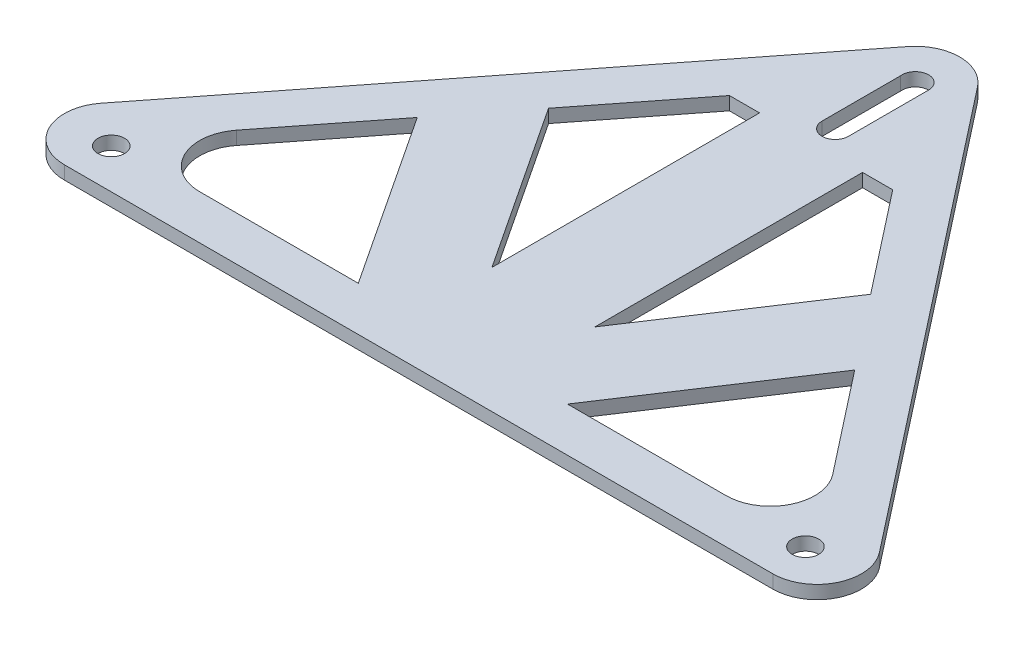
ISO-10303-21;
HEADER;
FILE_DESCRIPTION(('STEP AP214'),'2;1');
FILE_NAME('part.step','',(''),(''),'','','');
FILE_SCHEMA(('AUTOMOTIVE_DESIGN { 1 0 10303 214 1 1 1 1 }'));
ENDSEC;
DATA;
#1=APPLICATION_CONTEXT('core data for automotive mechanical design processes');
#2=APPLICATION_PROTOCOL_DEFINITION('international standard','automotive_design',2000,#1);
#3=PRODUCT_CONTEXT('',#1,'mechanical');
#4=PRODUCT('Part','Part','',(#3));
#5=PRODUCT_RELATED_PRODUCT_CATEGORY('part','',(#4));
#6=PRODUCT_DEFINITION_FORMATION('','',#4);
#7=PRODUCT_DEFINITION_CONTEXT('part definition',#1,'design');
#8=PRODUCT_DEFINITION('design','',#6,#7);
#9=PRODUCT_DEFINITION_SHAPE('','',#8);
#10=(LENGTH_UNIT() NAMED_UNIT(*) SI_UNIT(.MILLI.,.METRE.));
#11=(NAMED_UNIT(*) PLANE_ANGLE_UNIT() SI_UNIT($,.RADIAN.));
#12=(NAMED_UNIT(*) SI_UNIT($,.STERADIAN.) SOLID_ANGLE_UNIT());
#13=UNCERTAINTY_MEASURE_WITH_UNIT(LENGTH_MEASURE(1.E-05),#10,'distance_accuracy_value','');
#14=(GEOMETRIC_REPRESENTATION_CONTEXT(3) GLOBAL_UNCERTAINTY_ASSIGNED_CONTEXT((#13)) GLOBAL_UNIT_ASSIGNED_CONTEXT((#10,
#11,#12)) REPRESENTATION_CONTEXT('',''));
#15=CARTESIAN_POINT('',(0.,0.,0.));
#16=DIRECTION('',(0.,0.,1.));
#17=DIRECTION('',(1.,0.,0.));
#18=AXIS2_PLACEMENT_3D('',#15,#16,#17);
#19=CARTESIAN_POINT('',(0.,3.,-1.02499070242819));
#20=DIRECTION('',(0.,0.,-1.));
#21=DIRECTION('',(-1.,0.,0.));
#22=AXIS2_PLACEMENT_3D('',#19,#20,#21);
#23=PLANE('',#22);
#24=DIRECTION('',(1.,0.,0.));
#25=VECTOR('',#24,1.);
#26=CARTESIAN_POINT('',(0.,0.,-1.02499070242819));
#27=LINE('',#26,#25);
#28=CARTESIAN_POINT('',(18.9105208437726,0.,-1.02499070242819));
#29=VERTEX_POINT('',#28);
#30=CARTESIAN_POINT('',(54.7068248099256,0.,-1.0249907024282));
#31=VERTEX_POINT('',#30);
#32=EDGE_CURVE('E422',#29,#31,#27,.T.);
#33=ORIENTED_EDGE('',*,*,#32,.F.);
#34=DIRECTION('',(0.,-1.,0.));
#35=VECTOR('',#34,1.);
#36=CARTESIAN_POINT('',(18.9105208437726,3.,-1.02499070242819));
#37=LINE('',#36,#35);
#38=CARTESIAN_POINT('',(18.9105208437726,3.,-1.02499070242819));
#39=VERTEX_POINT('',#38);
#40=EDGE_CURVE('E11',#39,#29,#37,.T.);
#41=ORIENTED_EDGE('',*,*,#40,.F.);
#42=DIRECTION('',(1.,0.,0.));
#43=VECTOR('',#42,1.);
#44=CARTESIAN_POINT('',(0.,3.,-1.02499070242819));
#45=LINE('',#44,#43);
#46=CARTESIAN_POINT('',(54.7068248099256,3.,-1.0249907024282));
#47=VERTEX_POINT('',#46);
#48=EDGE_CURVE('E237',#39,#47,#45,.T.);
#49=ORIENTED_EDGE('',*,*,#48,.T.);
#50=DIRECTION('',(0.,-1.,0.));
#51=VECTOR('',#50,1.);
#52=CARTESIAN_POINT('',(54.7068248099256,3.,-1.0249907024282));
#53=LINE('',#52,#51);
#54=EDGE_CURVE('E61',#47,#31,#53,.T.);
#55=ORIENTED_EDGE('',*,*,#54,.T.);
#56=EDGE_LOOP('',(#33,#41,#49,#55));
#57=FACE_BOUND('',#56,.T.);
#58=ADVANCED_FACE('F41',(#57),#23,.T.);
#59=CARTESIAN_POINT('',(18.9105208437726,3.,-11.0249907024304));
#60=DIRECTION('',(0.,-1.,0.));
#61=DIRECTION('',(0.,0.,-1.));
#62=AXIS2_PLACEMENT_3D('',#59,#60,#61);
#63=CYLINDRICAL_SURFACE('',#62,10.0000000000022);
#64=CARTESIAN_POINT('',(18.9105208437726,0.,-11.0249907024304));
#65=DIRECTION('',(0.,1.,0.));
#66=DIRECTION('',(0.,0.,1.));
#67=AXIS2_PLACEMENT_3D('',#64,#65,#66);
#68=CIRCLE('',#67,10.0000000000022);
#69=CARTESIAN_POINT('',(11.0371875782402,0.,-17.1902663077789));
#70=VERTEX_POINT('',#69);
#71=EDGE_CURVE('E243',#29,#70,#68,.F.);
#72=ORIENTED_EDGE('',*,*,#71,.T.);
#73=DIRECTION('',(0.,-1.,0.));
#74=VECTOR('',#73,1.);
#75=CARTESIAN_POINT('',(11.0371875782402,3.,-17.1902663077789));
#76=LINE('',#75,#74);
#77=CARTESIAN_POINT('',(11.0371875782402,3.,-17.1902663077789));
#78=VERTEX_POINT('',#77);
#79=EDGE_CURVE('E52',#78,#70,#76,.T.);
#80=ORIENTED_EDGE('',*,*,#79,.F.);
#81=CARTESIAN_POINT('',(18.9105208437726,3.,-11.0249907024304));
#82=DIRECTION('',(0.,1.,0.));
#83=DIRECTION('',(0.,0.,1.));
#84=AXIS2_PLACEMENT_3D('',#81,#82,#83);
#85=CIRCLE('',#84,10.0000000000022);
#86=EDGE_CURVE('E232',#39,#78,#85,.F.);
#87=ORIENTED_EDGE('',*,*,#86,.F.);
#88=ORIENTED_EDGE('',*,*,#40,.T.);
#89=EDGE_LOOP('',(#72,#80,#87,#88));
#90=FACE_BOUND('',#89,.T.);
#91=ADVANCED_FACE('F241',(#90),#63,.F.);
#92=CARTESIAN_POINT('',(-1.50248971268427,3.,-1.17653639957702));
#93=DIRECTION('',(-0.787333326553064,0.,-0.616527560534715));
#94=DIRECTION('',(-0.616527560534715,0.,0.787333326553064));
#95=AXIS2_PLACEMENT_3D('',#92,#93,#94);
#96=PLANE('',#95);
#97=DIRECTION('',(0.616527560534715,0.,-0.787333326553064));
#98=VECTOR('',#97,1.);
#99=CARTESIAN_POINT('',(-1.50248971268427,0.,-1.17653639957702));
#100=LINE('',#99,#98);
#101=CARTESIAN_POINT('',(28.959351543245,0.,-40.0776729329725));
#102=VERTEX_POINT('',#101);
#103=EDGE_CURVE('E427',#70,#102,#100,.T.);
#104=ORIENTED_EDGE('',*,*,#103,.T.);
#105=DIRECTION('',(0.,-1.,0.));
#106=VECTOR('',#105,1.);
#107=CARTESIAN_POINT('',(28.959351543245,3.,-40.0776729329725));
#108=LINE('',#107,#106);
#109=CARTESIAN_POINT('',(28.959351543245,3.,-40.0776729329725));
#110=VERTEX_POINT('',#109);
#111=EDGE_CURVE('E141',#110,#102,#108,.T.);
#112=ORIENTED_EDGE('',*,*,#111,.F.);
#113=DIRECTION('',(0.616527560534715,0.,-0.787333326553064));
#114=VECTOR('',#113,1.);
#115=CARTESIAN_POINT('',(-1.50248971268427,3.,-1.17653639957702));
#116=LINE('',#115,#114);
#117=EDGE_CURVE('E223',#78,#110,#116,.T.);
#118=ORIENTED_EDGE('',*,*,#117,.F.);
#119=ORIENTED_EDGE('',*,*,#79,.T.);
#120=EDGE_LOOP('',(#104,#112,#118,#119));
#121=FACE_BOUND('',#120,.T.);
#122=ADVANCED_FACE('F225',(#121),#96,.F.);
#123=CARTESIAN_POINT('',(98.5850287421724,3.,-77.1977829793542));
#124=DIRECTION('',(-0.787333326553063,0.,0.616527560534716));
#125=DIRECTION('',(0.616527560534716,0.,0.787333326553063));
#126=AXIS2_PLACEMENT_3D('',#123,#124,#125);
#127=PLANE('',#126);
#128=DIRECTION('',(-0.616527560534716,0.,-0.787333326553063));
#129=VECTOR('',#128,1.);
#130=CARTESIAN_POINT('',(98.5850287421724,0.,-77.1977829793542));
#131=LINE('',#130,#129);
#132=CARTESIAN_POINT('',(114.646703404888,0.,-56.6863045772514));
#133=VERTEX_POINT('',#132);
#134=CARTESIAN_POINT('',(96.7245394398833,0.,-79.5737112024449));
#135=VERTEX_POINT('',#134);
#136=EDGE_CURVE('E406',#133,#135,#131,.T.);
#137=ORIENTED_EDGE('',*,*,#136,.F.);
#138=DIRECTION('',(0.,-1.,0.));
#139=VECTOR('',#138,1.);
#140=CARTESIAN_POINT('',(114.646703404888,3.,-56.6863045772514));
#141=LINE('',#140,#139);
#142=CARTESIAN_POINT('',(114.646703404888,3.,-56.6863045772514));
#143=VERTEX_POINT('',#142);
#144=EDGE_CURVE('E260',#143,#133,#141,.T.);
#145=ORIENTED_EDGE('',*,*,#144,.F.);
#146=DIRECTION('',(-0.616527560534716,0.,-0.787333326553063));
#147=VECTOR('',#146,1.);
#148=CARTESIAN_POINT('',(98.5850287421724,3.,-77.1977829793542));
#149=LINE('',#148,#147);
#150=CARTESIAN_POINT('',(96.7245394398833,3.,-79.5737112024449));
#151=VERTEX_POINT('',#150);
#152=EDGE_CURVE('E508',#143,#151,#149,.T.);
#153=ORIENTED_EDGE('',*,*,#152,.T.);
#154=DIRECTION('',(0.,-1.,0.));
#155=VECTOR('',#154,1.);
#156=CARTESIAN_POINT('',(96.7245394398833,3.,-79.5737112024449));
#157=LINE('',#156,#155);
#158=EDGE_CURVE('E250',#151,#135,#157,.T.);
#159=ORIENTED_EDGE('',*,*,#158,.T.);
#160=EDGE_LOOP('',(#137,#145,#153,#159));
#161=FACE_BOUND('',#160,.T.);
#162=ADVANCED_FACE('F561',(#161),#127,.T.);
#163=CARTESIAN_POINT('',(53.8611268453369,3.,35.5106959203676));
#164=DIRECTION('',(-0.834877593213002,0.,-0.550435649600264));
#165=DIRECTION('',(-0.550435649600264,0.,0.834877593213002));
#166=AXIS2_PLACEMENT_3D('',#163,#164,#165);
#167=PLANE('',#166);
#168=DIRECTION('',(0.550435649600264,0.,-0.834877593213002));
#169=VECTOR('',#168,1.);
#170=CARTESIAN_POINT('',(53.8611268453369,0.,35.5106959203676));
#171=LINE('',#170,#169);
#172=CARTESIAN_POINT('',(89.9269461278148,0.,-19.192418642937));
#173=VERTEX_POINT('',#172);
#174=EDGE_CURVE('E410',#173,#133,#171,.T.);
#175=ORIENTED_EDGE('',*,*,#174,.F.);
#176=DIRECTION('',(0.,-1.,0.));
#177=VECTOR('',#176,1.);
#178=CARTESIAN_POINT('',(89.9269461278148,3.,-19.192418642937));
#179=LINE('',#178,#177);
#180=CARTESIAN_POINT('',(89.9269461278148,3.,-19.192418642937));
#181=VERTEX_POINT('',#180);
#182=EDGE_CURVE('E257',#181,#173,#179,.T.);
#183=ORIENTED_EDGE('',*,*,#182,.F.);
#184=DIRECTION('',(0.550435649600264,0.,-0.834877593213002));
#185=VECTOR('',#184,1.);
#186=CARTESIAN_POINT('',(53.8611268453369,3.,35.5106959203676));
#187=LINE('',#186,#185);
#188=EDGE_CURVE('E512',#181,#143,#187,.T.);
#189=ORIENTED_EDGE('',*,*,#188,.T.);
#190=ORIENTED_EDGE('',*,*,#144,.T.);
#191=EDGE_LOOP('',(#175,#183,#189,#190));
#192=FACE_BOUND('',#191,.T.);
#193=ADVANCED_FACE('F557',(#192),#167,.T.);
#194=CARTESIAN_POINT('',(89.9269461278148,3.,0.));
#195=DIRECTION('',(1.,0.,0.));
#196=DIRECTION('',(0.,0.,-1.));
#197=AXIS2_PLACEMENT_3D('',#194,#195,#196);
#198=PLANE('',#197);
#199=DIRECTION('',(0.,0.,1.));
#200=VECTOR('',#199,1.);
#201=CARTESIAN_POINT('',(89.9269461278148,0.,0.));
#202=LINE('',#201,#200);
#203=CARTESIAN_POINT('',(89.9269461278148,0.,-79.5737112024449));
#204=VERTEX_POINT('',#203);
#205=EDGE_CURVE('E414',#204,#173,#202,.T.);
#206=ORIENTED_EDGE('',*,*,#205,.F.);
#207=DIRECTION('',(0.,-1.,0.));
#208=VECTOR('',#207,1.);
#209=CARTESIAN_POINT('',(89.9269461278148,3.,-79.5737112024449));
#210=LINE('',#209,#208);
#211=CARTESIAN_POINT('',(89.9269461278148,3.,-79.5737112024449));
#212=VERTEX_POINT('',#211);
#213=EDGE_CURVE('E253',#212,#204,#210,.T.);
#214=ORIENTED_EDGE('',*,*,#213,.F.);
#215=DIRECTION('',(0.,0.,1.));
#216=VECTOR('',#215,1.);
#217=CARTESIAN_POINT('',(89.9269461278148,3.,0.));
#218=LINE('',#217,#216);
#219=EDGE_CURVE('E516',#212,#181,#218,.T.);
#220=ORIENTED_EDGE('',*,*,#219,.T.);
#221=ORIENTED_EDGE('',*,*,#182,.T.);
#222=EDGE_LOOP('',(#206,#214,#220,#221));
#223=FACE_BOUND('',#222,.T.);
#224=ADVANCED_FACE('F553',(#223),#198,.T.);
#225=CARTESIAN_POINT('',(66.6846285997186,3.,0.));
#226=DIRECTION('',(1.,0.,0.));
#227=DIRECTION('',(0.,0.,-1.));
#228=AXIS2_PLACEMENT_3D('',#225,#226,#227);
#229=PLANE('',#228);
#230=DIRECTION('',(0.,0.,1.));
#231=VECTOR('',#230,1.);
#232=CARTESIAN_POINT('',(66.6846285997186,0.,0.));
#233=LINE('',#232,#231);
#234=CARTESIAN_POINT('',(66.6846285997186,0.,-79.5737112024449));
#235=VERTEX_POINT('',#234);
#236=CARTESIAN_POINT('',(66.6846285997186,0.,-19.192418642937));
#237=VERTEX_POINT('',#236);
#238=EDGE_CURVE('E391',#235,#237,#233,.T.);
#239=ORIENTED_EDGE('',*,*,#238,.T.);
#240=DIRECTION('',(0.,-1.,0.));
#241=VECTOR('',#240,1.);
#242=CARTESIAN_POINT('',(66.6846285997186,3.,-19.192418642937));
#243=LINE('',#242,#241);
#244=CARTESIAN_POINT('',(66.6846285997186,3.,-19.192418642937));
#245=VERTEX_POINT('',#244);
#246=EDGE_CURVE('E254',#245,#237,#243,.T.);
#247=ORIENTED_EDGE('',*,*,#246,.F.);
#248=DIRECTION('',(0.,0.,1.));
#249=VECTOR('',#248,1.);
#250=CARTESIAN_POINT('',(66.6846285997186,3.,0.));
#251=LINE('',#250,#249);
#252=CARTESIAN_POINT('',(66.6846285997186,3.,-79.5737112024449));
#253=VERTEX_POINT('',#252);
#254=EDGE_CURVE('E494',#253,#245,#251,.T.);
#255=ORIENTED_EDGE('',*,*,#254,.F.);
#256=DIRECTION('',(0.,-1.,0.));
#257=VECTOR('',#256,1.);
#258=CARTESIAN_POINT('',(66.6846285997186,3.,-79.5737112024449));
#259=LINE('',#258,#257);
#260=EDGE_CURVE('E263',#253,#235,#259,.T.);
#261=ORIENTED_EDGE('',*,*,#260,.T.);
#262=EDGE_LOOP('',(#239,#247,#255,#261));
#263=FACE_BOUND('',#262,.T.);
#264=ADVANCED_FACE('F556',(#263),#229,.F.);
#265=CARTESIAN_POINT('',(55.3003662567975,3.,-36.459587933781));
#266=DIRECTION('',(-0.834877593213002,0.,0.550435649600264));
#267=DIRECTION('',(0.550435649600264,0.,0.834877593213002));
#268=AXIS2_PLACEMENT_3D('',#265,#266,#267);
#269=PLANE('',#268);
#270=DIRECTION('',(-0.550435649600264,0.,-0.834877593213002));
#271=VECTOR('',#270,1.);
#272=CARTESIAN_POINT('',(55.3003662567975,0.,-36.459587933781));
#273=LINE('',#272,#271);
#274=CARTESIAN_POINT('',(41.9648713226454,0.,-56.6863045772513));
#275=VERTEX_POINT('',#274);
#276=EDGE_CURVE('E395',#237,#275,#273,.T.);
#277=ORIENTED_EDGE('',*,*,#276,.T.);
#278=DIRECTION('',(0.,-1.,0.));
#279=VECTOR('',#278,1.);
#280=CARTESIAN_POINT('',(41.9648713226454,3.,-56.6863045772513));
#281=LINE('',#280,#279);
#282=CARTESIAN_POINT('',(41.9648713226454,3.,-56.6863045772513));
#283=VERTEX_POINT('',#282);
#284=EDGE_CURVE('E270',#283,#275,#281,.T.);
#285=ORIENTED_EDGE('',*,*,#284,.F.);
#286=DIRECTION('',(-0.550435649600264,0.,-0.834877593213002));
#287=VECTOR('',#286,1.);
#288=CARTESIAN_POINT('',(55.3003662567975,3.,-36.459587933781));
#289=LINE('',#288,#287);
#290=EDGE_CURVE('E498',#245,#283,#289,.T.);
#291=ORIENTED_EDGE('',*,*,#290,.F.);
#292=ORIENTED_EDGE('',*,*,#246,.T.);
#293=EDGE_LOOP('',(#277,#285,#291,#292));
#294=FACE_BOUND('',#293,.T.);
#295=ADVANCED_FACE('F574',(#294),#269,.F.);
#296=CARTESIAN_POINT('',(-1.50248971268426,3.,-1.17653639957701));
#297=DIRECTION('',(-0.787333326553064,0.,-0.616527560534715));
#298=DIRECTION('',(-0.616527560534715,0.,0.787333326553064));
#299=AXIS2_PLACEMENT_3D('',#296,#297,#298);
#300=PLANE('',#299);
#301=DIRECTION('',(0.616527560534715,0.,-0.787333326553064));
#302=VECTOR('',#301,1.);
#303=CARTESIAN_POINT('',(-1.50248971268426,0.,-1.17653639957701));
#304=LINE('',#303,#302);
#305=CARTESIAN_POINT('',(59.8870352876502,0.,-79.5737112024449));
#306=VERTEX_POINT('',#305);
#307=EDGE_CURVE('E398',#275,#306,#304,.T.);
#308=ORIENTED_EDGE('',*,*,#307,.T.);
#309=DIRECTION('',(0.,-1.,0.));
#310=VECTOR('',#309,1.);
#311=CARTESIAN_POINT('',(59.8870352876502,3.,-79.5737112024449));
#312=LINE('',#311,#310);
#313=CARTESIAN_POINT('',(59.8870352876502,3.,-79.5737112024449));
#314=VERTEX_POINT('',#313);
#315=EDGE_CURVE('E266',#314,#306,#312,.T.);
#316=ORIENTED_EDGE('',*,*,#315,.F.);
#317=DIRECTION('',(0.616527560534715,0.,-0.787333326553064));
#318=VECTOR('',#317,1.);
#319=CARTESIAN_POINT('',(-1.50248971268426,3.,-1.17653639957701));
#320=LINE('',#319,#318);
#321=EDGE_CURVE('E501',#283,#314,#320,.T.);
#322=ORIENTED_EDGE('',*,*,#321,.F.);
#323=ORIENTED_EDGE('',*,*,#284,.T.);
#324=EDGE_LOOP('',(#308,#316,#322,#323));
#325=FACE_BOUND('',#324,.T.);
#326=ADVANCED_FACE('F570',(#325),#300,.F.);
#327=CARTESIAN_POINT('',(78.3057873637667,3.,-85.0300732488884));
#328=DIRECTION('',(0.,-1.,0.));
#329=DIRECTION('',(0.,0.,-1.));
#330=AXIS2_PLACEMENT_3D('',#327,#328,#329);
#331=CYLINDRICAL_SURFACE('',#330,2.97855980263742);
#332=CARTESIAN_POINT('',(78.3057873637667,0.,-85.0300732488884));
#333=DIRECTION('',(0.,1.,0.));
#334=DIRECTION('',(0.,0.,1.));
#335=AXIS2_PLACEMENT_3D('',#332,#333,#334);
#336=CIRCLE('',#335,2.97855980263742);
#337=CARTESIAN_POINT('',(75.3272275611293,0.,-85.0300732488884));
#338=VERTEX_POINT('',#337);
#339=CARTESIAN_POINT('',(81.2843471664041,0.,-85.0300732488884));
#340=VERTEX_POINT('',#339);
#341=EDGE_CURVE('E367',#338,#340,#336,.T.);
#342=ORIENTED_EDGE('',*,*,#341,.F.);
#343=DIRECTION('',(0.,-1.,0.));
#344=VECTOR('',#343,1.);
#345=CARTESIAN_POINT('',(75.3272275611293,3.,-85.0300732488884));
#346=LINE('',#345,#344);
#347=CARTESIAN_POINT('',(75.3272275611293,3.,-85.0300732488884));
#348=VERTEX_POINT('',#347);
#349=EDGE_CURVE('E267',#348,#338,#346,.T.);
#350=ORIENTED_EDGE('',*,*,#349,.F.);
#351=CARTESIAN_POINT('',(78.3057873637667,3.,-85.0300732488884));
#352=DIRECTION('',(0.,1.,0.));
#353=DIRECTION('',(0.,0.,1.));
#354=AXIS2_PLACEMENT_3D('',#351,#352,#353);
#355=CIRCLE('',#354,2.97855980263742);
#356=CARTESIAN_POINT('',(81.2843471664041,3.,-85.0300732488884));
#357=VERTEX_POINT('',#356);
#358=EDGE_CURVE('E471',#348,#357,#355,.T.);
#359=ORIENTED_EDGE('',*,*,#358,.T.);
#360=DIRECTION('',(0.,-1.,0.));
#361=VECTOR('',#360,1.);
#362=CARTESIAN_POINT('',(81.2843471664041,3.,-85.0300732488884));
#363=LINE('',#362,#361);
#364=EDGE_CURVE('E277',#357,#340,#363,.T.);
#365=ORIENTED_EDGE('',*,*,#364,.T.);
#366=EDGE_LOOP('',(#342,#350,#359,#365));
#367=FACE_BOUND('',#366,.T.);
#368=ADVANCED_FACE('F573',(#367),#331,.F.);
#369=CARTESIAN_POINT('',(75.3272275611293,3.,0.));
#370=DIRECTION('',(1.,0.,0.));
#371=DIRECTION('',(0.,0.,-1.));
#372=AXIS2_PLACEMENT_3D('',#369,#370,#371);
#373=PLANE('',#372);
#374=DIRECTION('',(0.,0.,1.));
#375=VECTOR('',#374,1.);
#376=CARTESIAN_POINT('',(75.3272275611293,0.,0.));
#377=LINE('',#376,#375);
#378=CARTESIAN_POINT('',(75.3272275611293,0.,-102.737258658333));
#379=VERTEX_POINT('',#378);
#380=EDGE_CURVE('E371',#379,#338,#377,.T.);
#381=ORIENTED_EDGE('',*,*,#380,.F.);
#382=DIRECTION('',(0.,-1.,0.));
#383=VECTOR('',#382,1.);
#384=CARTESIAN_POINT('',(75.3272275611293,3.,-102.737258658333));
#385=LINE('',#384,#383);
#386=CARTESIAN_POINT('',(75.3272275611293,3.,-102.737258658333));
#387=VERTEX_POINT('',#386);
#388=EDGE_CURVE('E284',#387,#379,#385,.T.);
#389=ORIENTED_EDGE('',*,*,#388,.F.);
#390=DIRECTION('',(0.,0.,1.));
#391=VECTOR('',#390,1.);
#392=CARTESIAN_POINT('',(75.3272275611293,3.,0.));
#393=LINE('',#392,#391);
#394=EDGE_CURVE('E475',#387,#348,#393,.T.);
#395=ORIENTED_EDGE('',*,*,#394,.T.);
#396=ORIENTED_EDGE('',*,*,#349,.T.);
#397=EDGE_LOOP('',(#381,#389,#395,#396));
#398=FACE_BOUND('',#397,.T.);
#399=ADVANCED_FACE('F597',(#398),#373,.T.);
#400=CARTESIAN_POINT('',(78.3057873637667,3.,-103.09528310179));
#401=DIRECTION('',(0.,-1.,0.));
#402=DIRECTION('',(0.,0.,-1.));
#403=AXIS2_PLACEMENT_3D('',#400,#401,#402);
#404=CYLINDRICAL_SURFACE('',#403,3.00000000000001);
#405=CARTESIAN_POINT('',(78.3057873637667,0.,-103.09528310179));
#406=DIRECTION('',(0.,1.,0.));
#407=DIRECTION('',(0.,0.,1.));
#408=AXIS2_PLACEMENT_3D('',#405,#406,#407);
#409=CIRCLE('',#408,3.00000000000001);
#410=CARTESIAN_POINT('',(81.2843471664041,0.,-102.737258658333));
#411=VERTEX_POINT('',#410);
#412=EDGE_CURVE('E375',#411,#379,#409,.T.);
#413=ORIENTED_EDGE('',*,*,#412,.F.);
#414=DIRECTION('',(0.,-1.,0.));
#415=VECTOR('',#414,1.);
#416=CARTESIAN_POINT('',(81.2843471664041,3.,-102.737258658333));
#417=LINE('',#416,#415);
#418=CARTESIAN_POINT('',(81.2843471664041,3.,-102.737258658333));
#419=VERTEX_POINT('',#418);
#420=EDGE_CURVE('E280',#419,#411,#417,.T.);
#421=ORIENTED_EDGE('',*,*,#420,.F.);
#422=CARTESIAN_POINT('',(78.3057873637667,3.,-103.09528310179));
#423=DIRECTION('',(0.,1.,0.));
#424=DIRECTION('',(0.,0.,1.));
#425=AXIS2_PLACEMENT_3D('',#422,#423,#424);
#426=CIRCLE('',#425,3.00000000000001);
#427=EDGE_CURVE('E479',#419,#387,#426,.T.);
#428=ORIENTED_EDGE('',*,*,#427,.T.);
#429=ORIENTED_EDGE('',*,*,#388,.T.);
#430=EDGE_LOOP('',(#413,#421,#428,#429));
#431=FACE_BOUND('',#430,.T.);
#432=ADVANCED_FACE('F593',(#431),#404,.F.);
#433=CARTESIAN_POINT('',(137.701053883761,3.,-11.0249907024304));
#434=DIRECTION('',(0.,-1.,0.));
#435=DIRECTION('',(0.,0.,-1.));
#436=AXIS2_PLACEMENT_3D('',#433,#434,#435);
#437=CYLINDRICAL_SURFACE('',#436,10.0000000000022);
#438=CARTESIAN_POINT('',(137.701053883761,0.,-11.0249907024304));
#439=DIRECTION('',(0.,1.,0.));
#440=DIRECTION('',(0.,0.,1.));
#441=AXIS2_PLACEMENT_3D('',#438,#439,#440);
#442=CIRCLE('',#441,10.0000000000022);
#443=CARTESIAN_POINT('',(137.701053883761,0.,-1.02499070242822));
#444=VERTEX_POINT('',#443);
#445=CARTESIAN_POINT('',(145.574387149293,0.,-17.1902663077789));
#446=VERTEX_POINT('',#445);
#447=EDGE_CURVE('E351',#444,#446,#442,.T.);
#448=ORIENTED_EDGE('',*,*,#447,.F.);
#449=DIRECTION('',(0.,-1.,0.));
#450=VECTOR('',#449,1.);
#451=CARTESIAN_POINT('',(137.701053883761,3.,-1.02499070242822));
#452=LINE('',#451,#450);
#453=CARTESIAN_POINT('',(137.701053883761,3.,-1.02499070242822));
#454=VERTEX_POINT('',#453);
#455=EDGE_CURVE('E281',#454,#444,#452,.T.);
#456=ORIENTED_EDGE('',*,*,#455,.F.);
#457=CARTESIAN_POINT('',(137.701053883761,3.,-11.0249907024304));
#458=DIRECTION('',(0.,1.,0.));
#459=DIRECTION('',(0.,0.,1.));
#460=AXIS2_PLACEMENT_3D('',#457,#458,#459);
#461=CIRCLE('',#460,10.0000000000022);
#462=CARTESIAN_POINT('',(145.574387149293,3.,-17.1902663077789));
#463=VERTEX_POINT('',#462);
#464=EDGE_CURVE('E456',#454,#463,#461,.T.);
#465=ORIENTED_EDGE('',*,*,#464,.T.);
#466=DIRECTION('',(0.,-1.,0.));
#467=VECTOR('',#466,1.);
#468=CARTESIAN_POINT('',(145.574387149293,3.,-17.1902663077789));
#469=LINE('',#468,#467);
#470=EDGE_CURVE('E289',#463,#446,#469,.T.);
#471=ORIENTED_EDGE('',*,*,#470,.T.);
#472=EDGE_LOOP('',(#448,#456,#465,#471));
#473=FACE_BOUND('',#472,.T.);
#474=ADVANCED_FACE('F596',(#473),#437,.F.);
#475=CARTESIAN_POINT('',(0.,3.,-1.02499070242814));
#476=DIRECTION('',(0.,0.,1.));
#477=DIRECTION('',(1.,0.,0.));
#478=AXIS2_PLACEMENT_3D('',#475,#476,#477);
#479=PLANE('',#478);
#480=DIRECTION('',(-1.,0.,0.));
#481=VECTOR('',#480,1.);
#482=CARTESIAN_POINT('',(0.,0.,-1.02499070242814));
#483=LINE('',#482,#481);
#484=CARTESIAN_POINT('',(101.904749917608,0.,-1.02499070242821));
#485=VERTEX_POINT('',#484);
#486=EDGE_CURVE('E355',#444,#485,#483,.T.);
#487=ORIENTED_EDGE('',*,*,#486,.T.);
#488=DIRECTION('',(0.,-1.,0.));
#489=VECTOR('',#488,1.);
#490=CARTESIAN_POINT('',(101.904749917608,3.,-1.02499070242821));
#491=LINE('',#490,#489);
#492=CARTESIAN_POINT('',(101.904749917608,3.,-1.02499070242821));
#493=VERTEX_POINT('',#492);
#494=EDGE_CURVE('E295',#493,#485,#491,.T.);
#495=ORIENTED_EDGE('',*,*,#494,.F.);
#496=DIRECTION('',(-1.,0.,0.));
#497=VECTOR('',#496,1.);
#498=CARTESIAN_POINT('',(0.,3.,-1.02499070242814));
#499=LINE('',#498,#497);
#500=EDGE_CURVE('E460',#454,#493,#499,.T.);
#501=ORIENTED_EDGE('',*,*,#500,.F.);
#502=ORIENTED_EDGE('',*,*,#455,.T.);
#503=EDGE_LOOP('',(#487,#495,#501,#502));
#504=FACE_BOUND('',#503,.T.);
#505=ADVANCED_FACE('F611',(#504),#479,.F.);
#506=CARTESIAN_POINT('',(70.5586787095969,3.,46.5194089123729));
#507=DIRECTION('',(-0.834877593213002,0.,-0.550435649600264));
#508=DIRECTION('',(-0.550435649600264,0.,0.834877593213002));
#509=AXIS2_PLACEMENT_3D('',#506,#507,#508);
#510=PLANE('',#509);
#511=DIRECTION('',(0.550435649600264,0.,-0.834877593213002));
#512=VECTOR('',#511,1.);
#513=CARTESIAN_POINT('',(70.5586787095969,0.,46.5194089123729));
#514=LINE('',#513,#512);
#515=CARTESIAN_POINT('',(127.652223184288,0.,-40.0776729329725));
#516=VERTEX_POINT('',#515);
#517=EDGE_CURVE('E359',#485,#516,#514,.T.);
#518=ORIENTED_EDGE('',*,*,#517,.T.);
#519=DIRECTION('',(0.,-1.,0.));
#520=VECTOR('',#519,1.);
#521=CARTESIAN_POINT('',(127.652223184288,3.,-40.0776729329725));
#522=LINE('',#521,#520);
#523=CARTESIAN_POINT('',(127.652223184288,3.,-40.0776729329725));
#524=VERTEX_POINT('',#523);
#525=EDGE_CURVE('E292',#524,#516,#522,.T.);
#526=ORIENTED_EDGE('',*,*,#525,.F.);
#527=DIRECTION('',(0.550435649600264,0.,-0.834877593213002));
#528=VECTOR('',#527,1.);
#529=CARTESIAN_POINT('',(70.5586787095969,3.,46.5194089123729));
#530=LINE('',#529,#528);
#531=EDGE_CURVE('E464',#493,#524,#530,.T.);
#532=ORIENTED_EDGE('',*,*,#531,.F.);
#533=ORIENTED_EDGE('',*,*,#494,.T.);
#534=EDGE_LOOP('',(#518,#526,#532,#533));
#535=FACE_BOUND('',#534,.T.);
#536=ADVANCED_FACE('F608',(#535),#510,.F.);
#537=CARTESIAN_POINT('',(-1.62115876405259,3.,-1.02499070242819));
#538=DIRECTION('',(0.,-1.,0.));
#539=DIRECTION('',(0.,0.,-1.));
#540=AXIS2_PLACEMENT_3D('',#537,#538,#539);
#541=CYLINDRICAL_SURFACE('',#540,10.);
#542=CARTESIAN_POINT('',(-1.62115876405259,0.,-1.02499070242819));
#543=DIRECTION('',(0.,1.,0.));
#544=DIRECTION('',(0.,0.,1.));
#545=AXIS2_PLACEMENT_3D('',#542,#543,#544);
#546=CIRCLE('',#545,10.);
#547=CARTESIAN_POINT('',(-9.49449202958322,0.,-7.19026630777535));
#548=VERTEX_POINT('',#547);
#549=CARTESIAN_POINT('',(-1.62115876405258,0.,8.97500929757181));
#550=VERTEX_POINT('',#549);
#551=EDGE_CURVE('E328',#548,#550,#546,.T.);
#552=ORIENTED_EDGE('',*,*,#551,.T.);
#553=DIRECTION('',(0.,-1.,0.));
#554=VECTOR('',#553,1.);
#555=CARTESIAN_POINT('',(-1.62115876405258,3.,8.97500929757181));
#556=LINE('',#555,#554);
#557=CARTESIAN_POINT('',(-1.62115876405258,3.,8.97500929757181));
#558=VERTEX_POINT('',#557);
#559=EDGE_CURVE('E45',#558,#550,#556,.T.);
#560=ORIENTED_EDGE('',*,*,#559,.F.);
#561=CARTESIAN_POINT('',(-1.62115876405259,3.,-1.02499070242819));
#562=DIRECTION('',(0.,1.,0.));
#563=DIRECTION('',(0.,0.,1.));
#564=AXIS2_PLACEMENT_3D('',#561,#562,#563);
#565=CIRCLE('',#564,10.);
#566=CARTESIAN_POINT('',(-9.49449202958322,3.,-7.19026630777535));
#567=VERTEX_POINT('',#566);
#568=EDGE_CURVE('E433',#567,#558,#565,.T.);
#569=ORIENTED_EDGE('',*,*,#568,.F.);
#570=DIRECTION('',(0.,-1.,0.));
#571=VECTOR('',#570,1.);
#572=CARTESIAN_POINT('',(-9.49449202958322,3.,-7.19026630777535));
#573=LINE('',#572,#571);
#574=EDGE_CURVE('E301',#567,#548,#573,.T.);
#575=ORIENTED_EDGE('',*,*,#574,.T.);
#576=EDGE_LOOP('',(#552,#560,#569,#575));
#577=FACE_BOUND('',#576,.T.);
#578=ADVANCED_FACE('F43',(#577),#541,.T.);
#579=CARTESIAN_POINT('',(0.,3.,8.97500929757181));
#580=DIRECTION('',(0.,0.,-1.));
#581=DIRECTION('',(-1.,0.,0.));
#582=AXIS2_PLACEMENT_3D('',#579,#580,#581);
#583=PLANE('',#582);
#584=DIRECTION('',(1.,0.,0.));
#585=VECTOR('',#584,1.);
#586=CARTESIAN_POINT('',(0.,0.,8.97500929757181));
#587=LINE('',#586,#585);
#588=CARTESIAN_POINT('',(158.232733491586,0.,8.97500929757175));
#589=VERTEX_POINT('',#588);
#590=EDGE_CURVE('E323',#550,#589,#587,.T.);
#591=ORIENTED_EDGE('',*,*,#590,.T.);
#592=DIRECTION('',(0.,-1.,0.));
#593=VECTOR('',#592,1.);
#594=CARTESIAN_POINT('',(158.232733491586,3.,8.97500929757175));
#595=LINE('',#594,#593);
#596=CARTESIAN_POINT('',(158.232733491586,3.,8.97500929757175));
#597=VERTEX_POINT('',#596);
#598=EDGE_CURVE('E313',#597,#589,#595,.T.);
#599=ORIENTED_EDGE('',*,*,#598,.F.);
#600=DIRECTION('',(1.,0.,0.));
#601=VECTOR('',#600,1.);
#602=CARTESIAN_POINT('',(0.,3.,8.97500929757181));
#603=LINE('',#602,#601);
#604=EDGE_CURVE('E154',#558,#597,#603,.T.);
#605=ORIENTED_EDGE('',*,*,#604,.F.);
#606=ORIENTED_EDGE('',*,*,#559,.T.);
#607=EDGE_LOOP('',(#591,#599,#605,#606));
#608=FACE_BOUND('',#607,.T.);
#609=ADVANCED_FACE('F322',(#608),#583,.F.);
#610=CARTESIAN_POINT('',(158.232733491586,3.,-1.02499070242825));
#611=DIRECTION('',(0.,-1.,0.));
#612=DIRECTION('',(0.,0.,-1.));
#613=AXIS2_PLACEMENT_3D('',#610,#611,#612);
#614=CYLINDRICAL_SURFACE('',#613,10.);
#615=CARTESIAN_POINT('',(158.232733491586,0.,-1.02499070242825));
#616=DIRECTION('',(0.,1.,0.));
#617=DIRECTION('',(0.,0.,1.));
#618=AXIS2_PLACEMENT_3D('',#615,#616,#617);
#619=CIRCLE('',#618,10.);
#620=CARTESIAN_POINT('',(166.106066757117,0.,-7.19026630777542));
#621=VERTEX_POINT('',#620);
#622=EDGE_CURVE('E335',#621,#589,#619,.F.);
#623=ORIENTED_EDGE('',*,*,#622,.F.);
#624=DIRECTION('',(0.,-1.,0.));
#625=VECTOR('',#624,1.);
#626=CARTESIAN_POINT('',(166.106066757117,3.,-7.19026630777542));
#627=LINE('',#626,#625);
#628=CARTESIAN_POINT('',(166.106066757117,3.,-7.19026630777542));
#629=VERTEX_POINT('',#628);
#630=EDGE_CURVE('E311',#629,#621,#627,.T.);
#631=ORIENTED_EDGE('',*,*,#630,.F.);
#632=CARTESIAN_POINT('',(158.232733491586,3.,-1.02499070242825));
#633=DIRECTION('',(0.,1.,0.));
#634=DIRECTION('',(0.,0.,1.));
#635=AXIS2_PLACEMENT_3D('',#632,#633,#634);
#636=CIRCLE('',#635,10.);
#637=EDGE_CURVE('E441',#629,#597,#636,.F.);
#638=ORIENTED_EDGE('',*,*,#637,.T.);
#639=ORIENTED_EDGE('',*,*,#598,.T.);
#640=EDGE_LOOP('',(#623,#631,#638,#639));
#641=FACE_BOUND('',#640,.T.);
#642=ADVANCED_FACE('F625',(#641),#614,.T.);
#643=CARTESIAN_POINT('',(106.458362007703,3.,-83.3630585847014));
#644=DIRECTION('',(-0.787333326553063,0.,0.616527560534716));
#645=DIRECTION('',(0.616527560534716,0.,0.787333326553063));
#646=AXIS2_PLACEMENT_3D('',#643,#644,#645);
#647=PLANE('',#646);
#648=DIRECTION('',(-0.616527560534716,0.,-0.787333326553063));
#649=VECTOR('',#648,1.);
#650=CARTESIAN_POINT('',(106.458362007703,0.,-83.3630585847014));
#651=LINE('',#650,#649);
#652=CARTESIAN_POINT('',(86.1791206292974,0.,-109.260558707137));
#653=VERTEX_POINT('',#652);
#654=EDGE_CURVE('E341',#621,#653,#651,.T.);
#655=ORIENTED_EDGE('',*,*,#654,.T.);
#656=DIRECTION('',(0.,-1.,0.));
#657=VECTOR('',#656,1.);
#658=CARTESIAN_POINT('',(86.1791206292974,3.,-109.260558707137));
#659=LINE('',#658,#657);
#660=CARTESIAN_POINT('',(86.1791206292974,3.,-109.260558707137));
#661=VERTEX_POINT('',#660);
#662=EDGE_CURVE('E307',#661,#653,#659,.T.);
#663=ORIENTED_EDGE('',*,*,#662,.F.);
#664=DIRECTION('',(-0.616527560534716,0.,-0.787333326553063));
#665=VECTOR('',#664,1.);
#666=CARTESIAN_POINT('',(106.458362007703,3.,-83.3630585847014));
#667=LINE('',#666,#665);
#668=EDGE_CURVE('E446',#629,#661,#667,.T.);
#669=ORIENTED_EDGE('',*,*,#668,.F.);
#670=ORIENTED_EDGE('',*,*,#630,.T.);
#671=EDGE_LOOP('',(#655,#663,#669,#670));
#672=FACE_BOUND('',#671,.T.);
#673=ADVANCED_FACE('F621',(#672),#647,.F.);
#674=CARTESIAN_POINT('',(78.3057873637667,3.,-103.09528310179));
#675=DIRECTION('',(0.,-1.,0.));
#676=DIRECTION('',(0.,0.,-1.));
#677=AXIS2_PLACEMENT_3D('',#674,#675,#676);
#678=CYLINDRICAL_SURFACE('',#677,10.);
#679=CARTESIAN_POINT('',(78.3057873637667,0.,-103.09528310179));
#680=DIRECTION('',(0.,1.,0.));
#681=DIRECTION('',(0.,0.,1.));
#682=AXIS2_PLACEMENT_3D('',#679,#680,#681);
#683=CIRCLE('',#682,10.);
#684=CARTESIAN_POINT('',(70.4324540982361,0.,-109.260558707137));
#685=VERTEX_POINT('',#684);
#686=EDGE_CURVE('E344',#653,#685,#683,.T.);
#687=ORIENTED_EDGE('',*,*,#686,.T.);
#688=DIRECTION('',(0.,-1.,0.));
#689=VECTOR('',#688,1.);
#690=CARTESIAN_POINT('',(70.4324540982361,3.,-109.260558707137));
#691=LINE('',#690,#689);
#692=CARTESIAN_POINT('',(70.4324540982361,3.,-109.260558707137));
#693=VERTEX_POINT('',#692);
#694=EDGE_CURVE('E304',#693,#685,#691,.T.);
#695=ORIENTED_EDGE('',*,*,#694,.F.);
#696=CARTESIAN_POINT('',(78.3057873637667,3.,-103.09528310179));
#697=DIRECTION('',(0.,1.,0.));
#698=DIRECTION('',(0.,0.,1.));
#699=AXIS2_PLACEMENT_3D('',#696,#697,#698);
#700=CIRCLE('',#699,10.);
#701=EDGE_CURVE('E449',#661,#693,#700,.T.);
#702=ORIENTED_EDGE('',*,*,#701,.F.);
#703=ORIENTED_EDGE('',*,*,#662,.T.);
#704=EDGE_LOOP('',(#687,#695,#702,#703));
#705=FACE_BOUND('',#704,.T.);
#706=ADVANCED_FACE('F551',(#705),#678,.T.);
#707=CARTESIAN_POINT('',(0.,3.,-79.5737112024449));
#708=DIRECTION('',(0.,0.,-1.));
#709=DIRECTION('',(-1.,0.,0.));
#710=AXIS2_PLACEMENT_3D('',#707,#708,#709);
#711=PLANE('',#710);
#712=DIRECTION('',(1.,0.,0.));
#713=VECTOR('',#712,1.);
#714=CARTESIAN_POINT('',(0.,0.,-79.5737112024449));
#715=LINE('',#714,#713);
#716=EDGE_CURVE('E418',#204,#135,#715,.T.);
#717=ORIENTED_EDGE('',*,*,#716,.T.);
#718=ORIENTED_EDGE('',*,*,#158,.F.);
#719=DIRECTION('',(1.,0.,0.));
#720=VECTOR('',#719,1.);
#721=CARTESIAN_POINT('',(0.,3.,-79.5737112024449));
#722=LINE('',#721,#720);
#723=EDGE_CURVE('E520',#212,#151,#722,.T.);
#724=ORIENTED_EDGE('',*,*,#723,.F.);
#725=ORIENTED_EDGE('',*,*,#213,.T.);
#726=EDGE_LOOP('',(#717,#718,#724,#725));
#727=FACE_BOUND('',#726,.T.);
#728=ADVANCED_FACE('F547',(#727),#711,.F.);
#729=CARTESIAN_POINT('',(0.,3.,-79.5737112024449));
#730=DIRECTION('',(0.,0.,1.));
#731=DIRECTION('',(1.,0.,0.));
#732=AXIS2_PLACEMENT_3D('',#729,#730,#731);
#733=PLANE('',#732);
#734=DIRECTION('',(-1.,0.,0.));
#735=VECTOR('',#734,1.);
#736=CARTESIAN_POINT('',(0.,0.,-79.5737112024449));
#737=LINE('',#736,#735);
#738=EDGE_CURVE('E402',#235,#306,#737,.T.);
#739=ORIENTED_EDGE('',*,*,#738,.F.);
#740=ORIENTED_EDGE('',*,*,#260,.F.);
#741=DIRECTION('',(-1.,0.,0.));
#742=VECTOR('',#741,1.);
#743=CARTESIAN_POINT('',(0.,3.,-79.5737112024449));
#744=LINE('',#743,#742);
#745=EDGE_CURVE('E504',#253,#314,#744,.T.);
#746=ORIENTED_EDGE('',*,*,#745,.T.);
#747=ORIENTED_EDGE('',*,*,#315,.T.);
#748=EDGE_LOOP('',(#739,#740,#746,#747));
#749=FACE_BOUND('',#748,.T.);
#750=ADVANCED_FACE('F550',(#749),#733,.T.);
#751=CARTESIAN_POINT('',(156.611574727533,3.,0.));
#752=DIRECTION('',(0.,-1.,0.));
#753=DIRECTION('',(0.,0.,-1.));
#754=AXIS2_PLACEMENT_3D('',#751,#752,#753);
#755=CYLINDRICAL_SURFACE('',#754,2.99999999999999);
#756=CARTESIAN_POINT('',(156.611574727533,3.,0.));
#757=DIRECTION('',(0.,1.,0.));
#758=DIRECTION('',(0.,0.,1.));
#759=AXIS2_PLACEMENT_3D('',#756,#757,#758);
#760=CIRCLE('',#759,2.99999999999999);
#761=CARTESIAN_POINT('',(156.611574727533,3.,2.99999999999999));
#762=VERTEX_POINT('',#761);
#763=EDGE_CURVE('E490',#762,#762,#760,.T.);
#764=ORIENTED_EDGE('',*,*,#763,.T.);
#765=EDGE_LOOP('',(#764));
#766=FACE_BOUND('',#765,.T.);
#767=CARTESIAN_POINT('',(156.611574727533,0.,0.));
#768=DIRECTION('',(0.,1.,0.));
#769=DIRECTION('',(0.,0.,1.));
#770=AXIS2_PLACEMENT_3D('',#767,#768,#769);
#771=CIRCLE('',#770,2.99999999999999);
#772=CARTESIAN_POINT('',(156.611574727533,0.,2.99999999999999));
#773=VERTEX_POINT('',#772);
#774=EDGE_CURVE('E387',#773,#773,#771,.T.);
#775=ORIENTED_EDGE('',*,*,#774,.F.);
#776=EDGE_LOOP('',(#775));
#777=FACE_BOUND('',#776,.T.);
#778=ADVANCED_FACE('F568',(#766,#777),#755,.F.);
#779=CARTESIAN_POINT('',(0.,3.,0.));
#780=DIRECTION('',(0.,-1.,0.));
#781=DIRECTION('',(0.,0.,-1.));
#782=AXIS2_PLACEMENT_3D('',#779,#780,#781);
#783=CYLINDRICAL_SURFACE('',#782,3.);
#784=CARTESIAN_POINT('',(0.,3.,0.));
#785=DIRECTION('',(0.,1.,0.));
#786=DIRECTION('',(0.,0.,1.));
#787=AXIS2_PLACEMENT_3D('',#784,#785,#786);
#788=CIRCLE('',#787,3.);
#789=CARTESIAN_POINT('',(0.,3.,3.));
#790=VERTEX_POINT('',#789);
#791=EDGE_CURVE('E486',#790,#790,#788,.T.);
#792=ORIENTED_EDGE('',*,*,#791,.T.);
#793=EDGE_LOOP('',(#792));
#794=FACE_BOUND('',#793,.T.);
#795=CARTESIAN_POINT('',(0.,0.,0.));
#796=DIRECTION('',(0.,1.,0.));
#797=DIRECTION('',(0.,0.,1.));
#798=AXIS2_PLACEMENT_3D('',#795,#796,#797);
#799=CIRCLE('',#798,3.);
#800=CARTESIAN_POINT('',(0.,0.,3.));
#801=VERTEX_POINT('',#800);
#802=EDGE_CURVE('E383',#801,#801,#799,.T.);
#803=ORIENTED_EDGE('',*,*,#802,.F.);
#804=EDGE_LOOP('',(#803));
#805=FACE_BOUND('',#804,.T.);
#806=ADVANCED_FACE('F584',(#794,#805),#783,.F.);
#807=CARTESIAN_POINT('',(81.2843471664041,3.,0.));
#808=DIRECTION('',(1.,0.,0.));
#809=DIRECTION('',(0.,0.,-1.));
#810=AXIS2_PLACEMENT_3D('',#807,#808,#809);
#811=PLANE('',#810);
#812=DIRECTION('',(0.,0.,1.));
#813=VECTOR('',#812,1.);
#814=CARTESIAN_POINT('',(81.2843471664041,0.,0.));
#815=LINE('',#814,#813);
#816=EDGE_CURVE('E379',#411,#340,#815,.T.);
#817=ORIENTED_EDGE('',*,*,#816,.T.);
#818=ORIENTED_EDGE('',*,*,#364,.F.);
#819=DIRECTION('',(0.,0.,1.));
#820=VECTOR('',#819,1.);
#821=CARTESIAN_POINT('',(81.2843471664041,3.,0.));
#822=LINE('',#821,#820);
#823=EDGE_CURVE('E483',#419,#357,#822,.T.);
#824=ORIENTED_EDGE('',*,*,#823,.F.);
#825=ORIENTED_EDGE('',*,*,#420,.T.);
#826=EDGE_LOOP('',(#817,#818,#824,#825));
#827=FACE_BOUND('',#826,.T.);
#828=ADVANCED_FACE('F588',(#827),#811,.F.);
#829=CARTESIAN_POINT('',(98.5850287421725,3.,-77.1977829793541));
#830=DIRECTION('',(-0.787333326553064,0.,0.616527560534715));
#831=DIRECTION('',(0.616527560534715,0.,0.787333326553064));
#832=AXIS2_PLACEMENT_3D('',#829,#830,#831);
#833=PLANE('',#832);
#834=DIRECTION('',(-0.616527560534715,0.,-0.787333326553064));
#835=VECTOR('',#834,1.);
#836=CARTESIAN_POINT('',(98.5850287421725,0.,-77.1977829793541));
#837=LINE('',#836,#835);
#838=EDGE_CURVE('E363',#446,#516,#837,.T.);
#839=ORIENTED_EDGE('',*,*,#838,.F.);
#840=ORIENTED_EDGE('',*,*,#470,.F.);
#841=DIRECTION('',(-0.616527560534715,0.,-0.787333326553064));
#842=VECTOR('',#841,1.);
#843=CARTESIAN_POINT('',(98.5850287421725,3.,-77.1977829793541));
#844=LINE('',#843,#842);
#845=EDGE_CURVE('E467',#463,#524,#844,.T.);
#846=ORIENTED_EDGE('',*,*,#845,.T.);
#847=ORIENTED_EDGE('',*,*,#525,.T.);
#848=EDGE_LOOP('',(#839,#840,#846,#847));
#849=FACE_BOUND('',#848,.T.);
#850=ADVANCED_FACE('F535',(#849),#833,.T.);
#851=CARTESIAN_POINT('',(-9.37582297821491,3.,-7.34181200492418));
#852=DIRECTION('',(-0.787333326553063,0.,-0.616527560534715));
#853=DIRECTION('',(-0.616527560534716,0.,0.787333326553064));
#854=AXIS2_PLACEMENT_3D('',#851,#852,#853);
#855=PLANE('',#854);
#856=DIRECTION('',(0.616527560534715,0.,-0.787333326553063));
#857=VECTOR('',#856,1.);
#858=CARTESIAN_POINT('',(-9.37582297821491,0.,-7.34181200492418));
#859=LINE('',#858,#857);
#860=EDGE_CURVE('E348',#548,#685,#859,.T.);
#861=ORIENTED_EDGE('',*,*,#860,.F.);
#862=ORIENTED_EDGE('',*,*,#574,.F.);
#863=DIRECTION('',(0.616527560534715,0.,-0.787333326553063));
#864=VECTOR('',#863,1.);
#865=CARTESIAN_POINT('',(-9.37582297821491,3.,-7.34181200492418));
#866=LINE('',#865,#864);
#867=EDGE_CURVE('E452',#567,#693,#866,.T.);
#868=ORIENTED_EDGE('',*,*,#867,.T.);
#869=ORIENTED_EDGE('',*,*,#694,.T.);
#870=EDGE_LOOP('',(#861,#862,#868,#869));
#871=FACE_BOUND('',#870,.T.);
#872=ADVANCED_FACE('F527',(#871),#855,.T.);
#873=CARTESIAN_POINT('',(38.6028143925375,3.,-25.4508749417757));
#874=DIRECTION('',(-0.834877593213002,0.,0.550435649600265));
#875=DIRECTION('',(0.550435649600265,0.,0.834877593213002));
#876=AXIS2_PLACEMENT_3D('',#873,#874,#875);
#877=PLANE('',#876);
#878=DIRECTION('',(-0.550435649600265,0.,-0.834877593213002));
#879=VECTOR('',#878,1.);
#880=CARTESIAN_POINT('',(38.6028143925375,0.,-25.4508749417757));
#881=LINE('',#880,#879);
#882=EDGE_CURVE('E430',#31,#102,#881,.T.);
#883=ORIENTED_EDGE('',*,*,#882,.F.);
#884=ORIENTED_EDGE('',*,*,#54,.F.);
#885=DIRECTION('',(-0.550435649600265,0.,-0.834877593213002));
#886=VECTOR('',#885,1.);
#887=CARTESIAN_POINT('',(38.6028143925375,3.,-25.4508749417757));
#888=LINE('',#887,#886);
#889=EDGE_CURVE('E231',#47,#110,#888,.T.);
#890=ORIENTED_EDGE('',*,*,#889,.T.);
#891=ORIENTED_EDGE('',*,*,#111,.T.);
#892=EDGE_LOOP('',(#883,#884,#890,#891));
#893=FACE_BOUND('',#892,.T.);
#894=ADVANCED_FACE('F525',(#893),#877,.T.);
#895=CARTESIAN_POINT('',(0.,3.,0.));
#896=DIRECTION('',(0.,1.,0.));
#897=DIRECTION('',(0.,0.,1.));
#898=AXIS2_PLACEMENT_3D('',#895,#896,#897);
#899=PLANE('',#898);
#900=ORIENTED_EDGE('',*,*,#568,.T.);
#901=ORIENTED_EDGE('',*,*,#604,.T.);
#902=ORIENTED_EDGE('',*,*,#637,.F.);
#903=ORIENTED_EDGE('',*,*,#668,.T.);
#904=ORIENTED_EDGE('',*,*,#701,.T.);
#905=ORIENTED_EDGE('',*,*,#867,.F.);
#906=EDGE_LOOP('',(#900,#901,#902,#903,#904,#905));
#907=FACE_BOUND('',#906,.T.);
#908=ORIENTED_EDGE('',*,*,#464,.F.);
#909=ORIENTED_EDGE('',*,*,#500,.T.);
#910=ORIENTED_EDGE('',*,*,#531,.T.);
#911=ORIENTED_EDGE('',*,*,#845,.F.);
#912=EDGE_LOOP('',(#908,#909,#910,#911));
#913=FACE_BOUND('',#912,.T.);
#914=ORIENTED_EDGE('',*,*,#358,.F.);
#915=ORIENTED_EDGE('',*,*,#394,.F.);
#916=ORIENTED_EDGE('',*,*,#427,.F.);
#917=ORIENTED_EDGE('',*,*,#823,.T.);
#918=EDGE_LOOP('',(#914,#915,#916,#917));
#919=FACE_BOUND('',#918,.T.);
#920=ORIENTED_EDGE('',*,*,#791,.F.);
#921=EDGE_LOOP('',(#920));
#922=FACE_BOUND('',#921,.T.);
#923=ORIENTED_EDGE('',*,*,#763,.F.);
#924=EDGE_LOOP('',(#923));
#925=FACE_BOUND('',#924,.T.);
#926=ORIENTED_EDGE('',*,*,#254,.T.);
#927=ORIENTED_EDGE('',*,*,#290,.T.);
#928=ORIENTED_EDGE('',*,*,#321,.T.);
#929=ORIENTED_EDGE('',*,*,#745,.F.);
#930=EDGE_LOOP('',(#926,#927,#928,#929));
#931=FACE_BOUND('',#930,.T.);
#932=ORIENTED_EDGE('',*,*,#152,.F.);
#933=ORIENTED_EDGE('',*,*,#188,.F.);
#934=ORIENTED_EDGE('',*,*,#219,.F.);
#935=ORIENTED_EDGE('',*,*,#723,.T.);
#936=EDGE_LOOP('',(#932,#933,#934,#935));
#937=FACE_BOUND('',#936,.T.);
#938=ORIENTED_EDGE('',*,*,#48,.F.);
#939=ORIENTED_EDGE('',*,*,#86,.T.);
#940=ORIENTED_EDGE('',*,*,#117,.T.);
#941=ORIENTED_EDGE('',*,*,#889,.F.);
#942=EDGE_LOOP('',(#938,#939,#940,#941));
#943=FACE_BOUND('',#942,.T.);
#944=ADVANCED_FACE('F236',(#907,#913,#919,#922,#925,#931,#937,#943),#899,.T.);
#945=CARTESIAN_POINT('',(0.,0.,0.));
#946=DIRECTION('',(0.,1.,0.));
#947=DIRECTION('',(0.,0.,1.));
#948=AXIS2_PLACEMENT_3D('',#945,#946,#947);
#949=PLANE('',#948);
#950=ORIENTED_EDGE('',*,*,#551,.F.);
#951=ORIENTED_EDGE('',*,*,#860,.T.);
#952=ORIENTED_EDGE('',*,*,#686,.F.);
#953=ORIENTED_EDGE('',*,*,#654,.F.);
#954=ORIENTED_EDGE('',*,*,#622,.T.);
#955=ORIENTED_EDGE('',*,*,#590,.F.);
#956=EDGE_LOOP('',(#950,#951,#952,#953,#954,#955));
#957=FACE_BOUND('',#956,.T.);
#958=ORIENTED_EDGE('',*,*,#447,.T.);
#959=ORIENTED_EDGE('',*,*,#838,.T.);
#960=ORIENTED_EDGE('',*,*,#517,.F.);
#961=ORIENTED_EDGE('',*,*,#486,.F.);
#962=EDGE_LOOP('',(#958,#959,#960,#961));
#963=FACE_BOUND('',#962,.T.);
#964=ORIENTED_EDGE('',*,*,#341,.T.);
#965=ORIENTED_EDGE('',*,*,#816,.F.);
#966=ORIENTED_EDGE('',*,*,#412,.T.);
#967=ORIENTED_EDGE('',*,*,#380,.T.);
#968=EDGE_LOOP('',(#964,#965,#966,#967));
#969=FACE_BOUND('',#968,.T.);
#970=ORIENTED_EDGE('',*,*,#802,.T.);
#971=EDGE_LOOP('',(#970));
#972=FACE_BOUND('',#971,.T.);
#973=ORIENTED_EDGE('',*,*,#774,.T.);
#974=EDGE_LOOP('',(#973));
#975=FACE_BOUND('',#974,.T.);
#976=ORIENTED_EDGE('',*,*,#238,.F.);
#977=ORIENTED_EDGE('',*,*,#738,.T.);
#978=ORIENTED_EDGE('',*,*,#307,.F.);
#979=ORIENTED_EDGE('',*,*,#276,.F.);
#980=EDGE_LOOP('',(#976,#977,#978,#979));
#981=FACE_BOUND('',#980,.T.);
#982=ORIENTED_EDGE('',*,*,#136,.T.);
#983=ORIENTED_EDGE('',*,*,#716,.F.);
#984=ORIENTED_EDGE('',*,*,#205,.T.);
#985=ORIENTED_EDGE('',*,*,#174,.T.);
#986=EDGE_LOOP('',(#982,#983,#984,#985));
#987=FACE_BOUND('',#986,.T.);
#988=ORIENTED_EDGE('',*,*,#32,.T.);
#989=ORIENTED_EDGE('',*,*,#882,.T.);
#990=ORIENTED_EDGE('',*,*,#103,.F.);
#991=ORIENTED_EDGE('',*,*,#71,.F.);
#992=EDGE_LOOP('',(#988,#989,#990,#991));
#993=FACE_BOUND('',#992,.T.);
#994=ADVANCED_FACE('F533',(#957,#963,#969,#972,#975,#981,#987,#993),#949,.F.);
#995=CLOSED_SHELL('',(#58,#91,#122,#162,#193,#224,#264,#295,#326,#368,#399,#432,#474,#505,#536,
#578,#609,#642,#673,#706,#728,#750,#778,#806,#828,#850,#872,#894,#944,#994));
#996=MANIFOLD_SOLID_BREP('B2',#995);
#997=ADVANCED_BREP_SHAPE_REPRESENTATION('',(#18,#996),#14);
#998=SHAPE_DEFINITION_REPRESENTATION(#9,#997);
ENDSEC;
END-ISO-10303-21;
